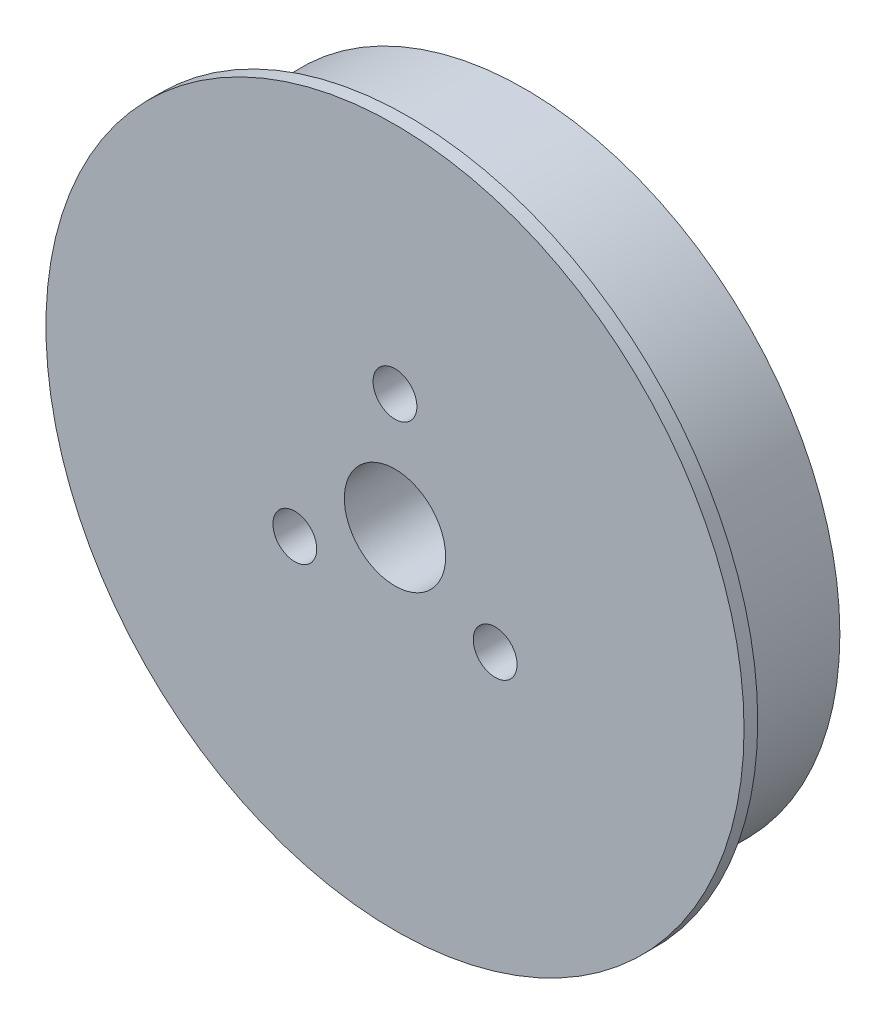
ISO-10303-21;
HEADER;
FILE_DESCRIPTION(('STEP AP214'),'2;1');
FILE_NAME('part.step','',(''),(''),'','','');
FILE_SCHEMA(('AUTOMOTIVE_DESIGN { 1 0 10303 214 1 1 1 1 }'));
ENDSEC;
DATA;
#1=APPLICATION_CONTEXT('core data for automotive mechanical design processes');
#2=APPLICATION_PROTOCOL_DEFINITION('international standard','automotive_design',2000,#1);
#3=PRODUCT_CONTEXT('',#1,'mechanical');
#4=PRODUCT('Part','Part','',(#3));
#5=PRODUCT_RELATED_PRODUCT_CATEGORY('part','',(#4));
#6=PRODUCT_DEFINITION_FORMATION('','',#4);
#7=PRODUCT_DEFINITION_CONTEXT('part definition',#1,'design');
#8=PRODUCT_DEFINITION('design','',#6,#7);
#9=PRODUCT_DEFINITION_SHAPE('','',#8);
#10=(LENGTH_UNIT() NAMED_UNIT(*) SI_UNIT(.MILLI.,.METRE.));
#11=(NAMED_UNIT(*) PLANE_ANGLE_UNIT() SI_UNIT($,.RADIAN.));
#12=(NAMED_UNIT(*) SI_UNIT($,.STERADIAN.) SOLID_ANGLE_UNIT());
#13=UNCERTAINTY_MEASURE_WITH_UNIT(LENGTH_MEASURE(1.E-05),#10,'distance_accuracy_value','');
#14=(GEOMETRIC_REPRESENTATION_CONTEXT(3) GLOBAL_UNCERTAINTY_ASSIGNED_CONTEXT((#13)) GLOBAL_UNIT_ASSIGNED_CONTEXT((#10,
#11,#12)) REPRESENTATION_CONTEXT('',''));
#15=CARTESIAN_POINT('',(0.,0.,0.));
#16=DIRECTION('',(0.,0.,1.));
#17=DIRECTION('',(1.,0.,0.));
#18=AXIS2_PLACEMENT_3D('',#15,#16,#17);
#19=CARTESIAN_POINT('',(0.,0.,0.));
#20=DIRECTION('',(0.,0.,1.));
#21=DIRECTION('',(1.,0.,0.));
#22=AXIS2_PLACEMENT_3D('',#19,#20,#21);
#23=PLANE('',#22);
#24=CARTESIAN_POINT('',(0.,8.45,0.));
#25=DIRECTION('',(0.,0.,-1.));
#26=DIRECTION('',(-1.,0.,0.));
#27=AXIS2_PLACEMENT_3D('',#24,#25,#26);
#28=CIRCLE('',#27,1.60000000000001);
#29=CARTESIAN_POINT('',(-1.60000000000001,8.45,0.));
#30=VERTEX_POINT('',#29);
#31=EDGE_CURVE('E80',#30,#30,#28,.T.);
#32=ORIENTED_EDGE('',*,*,#31,.F.);
#33=EDGE_LOOP('',(#32));
#34=FACE_BOUND('',#33,.T.);
#35=CARTESIAN_POINT('',(7.3179146619785,-4.225,0.));
#36=DIRECTION('',(0.,0.,-1.));
#37=DIRECTION('',(-1.,0.,0.));
#38=AXIS2_PLACEMENT_3D('',#35,#36,#37);
#39=CIRCLE('',#38,1.60000000000002);
#40=CARTESIAN_POINT('',(5.71791466197849,-4.225,0.));
#41=VERTEX_POINT('',#40);
#42=EDGE_CURVE('E74',#41,#41,#39,.T.);
#43=ORIENTED_EDGE('',*,*,#42,.F.);
#44=EDGE_LOOP('',(#43));
#45=FACE_BOUND('',#44,.T.);
#46=CARTESIAN_POINT('',(0.,0.,0.));
#47=DIRECTION('',(0.,0.,1.));
#48=DIRECTION('',(1.,0.,0.));
#49=AXIS2_PLACEMENT_3D('',#46,#47,#48);
#50=CIRCLE('',#49,23.);
#51=CARTESIAN_POINT('',(23.,0.,0.));
#52=VERTEX_POINT('',#51);
#53=EDGE_CURVE('E51',#52,#52,#50,.T.);
#54=ORIENTED_EDGE('',*,*,#53,.F.);
#55=EDGE_LOOP('',(#54));
#56=FACE_BOUND('',#55,.T.);
#57=CARTESIAN_POINT('',(0.,0.,0.));
#58=DIRECTION('',(0.,0.,1.));
#59=DIRECTION('',(1.,0.,0.));
#60=AXIS2_PLACEMENT_3D('',#57,#58,#59);
#61=CIRCLE('',#60,3.7);
#62=CARTESIAN_POINT('',(3.7,0.,0.));
#63=VERTEX_POINT('',#62);
#64=EDGE_CURVE('E46',#63,#63,#61,.T.);
#65=ORIENTED_EDGE('',*,*,#64,.T.);
#66=EDGE_LOOP('',(#65));
#67=FACE_BOUND('',#66,.T.);
#68=CARTESIAN_POINT('',(-7.31791466197851,-4.225,0.));
#69=DIRECTION('',(0.,0.,-1.));
#70=DIRECTION('',(-1.,0.,0.));
#71=AXIS2_PLACEMENT_3D('',#68,#69,#70);
#72=CIRCLE('',#71,1.60000000000001);
#73=CARTESIAN_POINT('',(-8.91791466197852,-4.225,0.));
#74=VERTEX_POINT('',#73);
#75=EDGE_CURVE('E68',#74,#74,#72,.T.);
#76=ORIENTED_EDGE('',*,*,#75,.F.);
#77=EDGE_LOOP('',(#76));
#78=FACE_BOUND('',#77,.T.);
#79=ADVANCED_FACE('F35',(#34,#45,#56,#67,#78),#23,.F.);
#80=CARTESIAN_POINT('',(0.,0.,9.5));
#81=DIRECTION('',(0.,0.,-1.));
#82=DIRECTION('',(-1.,0.,0.));
#83=AXIS2_PLACEMENT_3D('',#80,#81,#82);
#84=CYLINDRICAL_SURFACE('',#83,23.);
#85=ORIENTED_EDGE('',*,*,#53,.T.);
#86=EDGE_LOOP('',(#85));
#87=FACE_BOUND('',#86,.T.);
#88=CARTESIAN_POINT('',(0.,0.,8.5));
#89=DIRECTION('',(0.,0.,1.));
#90=DIRECTION('',(1.,0.,0.));
#91=AXIS2_PLACEMENT_3D('',#88,#89,#90);
#92=CIRCLE('',#91,23.);
#93=CARTESIAN_POINT('',(23.,0.,8.5));
#94=VERTEX_POINT('',#93);
#95=EDGE_CURVE('E10',#94,#94,#92,.T.);
#96=ORIENTED_EDGE('',*,*,#95,.F.);
#97=EDGE_LOOP('',(#96));
#98=FACE_BOUND('',#97,.T.);
#99=ADVANCED_FACE('F37',(#87,#98),#84,.T.);
#100=CARTESIAN_POINT('',(0.,0.,9.5));
#101=DIRECTION('',(0.,0.,-1.));
#102=DIRECTION('',(-1.,0.,0.));
#103=AXIS2_PLACEMENT_3D('',#100,#101,#102);
#104=CYLINDRICAL_SURFACE('',#103,3.7);
#105=CARTESIAN_POINT('',(0.,0.,9.5));
#106=DIRECTION('',(0.,0.,1.));
#107=DIRECTION('',(1.,0.,0.));
#108=AXIS2_PLACEMENT_3D('',#105,#106,#107);
#109=CIRCLE('',#108,3.7);
#110=CARTESIAN_POINT('',(3.7,0.,9.5));
#111=VERTEX_POINT('',#110);
#112=EDGE_CURVE('E42',#111,#111,#109,.T.);
#113=ORIENTED_EDGE('',*,*,#112,.T.);
#114=EDGE_LOOP('',(#113));
#115=FACE_BOUND('',#114,.T.);
#116=ORIENTED_EDGE('',*,*,#64,.F.);
#117=EDGE_LOOP('',(#116));
#118=FACE_BOUND('',#117,.T.);
#119=ADVANCED_FACE('F117',(#115,#118),#104,.F.);
#120=CARTESIAN_POINT('',(0.,0.,9.5));
#121=DIRECTION('',(0.,0.,1.));
#122=DIRECTION('',(1.,0.,0.));
#123=AXIS2_PLACEMENT_3D('',#120,#121,#122);
#124=PLANE('',#123);
#125=CARTESIAN_POINT('',(0.,8.45,9.5));
#126=DIRECTION('',(0.,0.,-1.));
#127=DIRECTION('',(-1.,0.,0.));
#128=AXIS2_PLACEMENT_3D('',#125,#126,#127);
#129=CIRCLE('',#128,1.60000000000001);
#130=CARTESIAN_POINT('',(-1.60000000000001,8.45,9.5));
#131=VERTEX_POINT('',#130);
#132=EDGE_CURVE('E77',#131,#131,#129,.T.);
#133=ORIENTED_EDGE('',*,*,#132,.T.);
#134=EDGE_LOOP('',(#133));
#135=FACE_BOUND('',#134,.T.);
#136=CARTESIAN_POINT('',(7.3179146619785,-4.225,9.5));
#137=DIRECTION('',(0.,0.,-1.));
#138=DIRECTION('',(-1.,0.,0.));
#139=AXIS2_PLACEMENT_3D('',#136,#137,#138);
#140=CIRCLE('',#139,1.60000000000001);
#141=CARTESIAN_POINT('',(5.71791466197849,-4.225,9.5));
#142=VERTEX_POINT('',#141);
#143=EDGE_CURVE('E71',#142,#142,#140,.T.);
#144=ORIENTED_EDGE('',*,*,#143,.T.);
#145=EDGE_LOOP('',(#144));
#146=FACE_BOUND('',#145,.T.);
#147=CARTESIAN_POINT('',(-7.31791466197851,-4.225,9.5));
#148=DIRECTION('',(0.,0.,-1.));
#149=DIRECTION('',(-1.,0.,0.));
#150=AXIS2_PLACEMENT_3D('',#147,#148,#149);
#151=CIRCLE('',#150,1.60000000000001);
#152=CARTESIAN_POINT('',(-8.91791466197852,-4.225,9.5));
#153=VERTEX_POINT('',#152);
#154=EDGE_CURVE('E64',#153,#153,#151,.T.);
#155=ORIENTED_EDGE('',*,*,#154,.T.);
#156=EDGE_LOOP('',(#155));
#157=FACE_BOUND('',#156,.T.);
#158=ORIENTED_EDGE('',*,*,#112,.F.);
#159=EDGE_LOOP('',(#158));
#160=FACE_BOUND('',#159,.T.);
#161=CARTESIAN_POINT('',(0.,0.,9.5));
#162=DIRECTION('',(0.,0.,1.));
#163=DIRECTION('',(1.,0.,0.));
#164=AXIS2_PLACEMENT_3D('',#161,#162,#163);
#165=CIRCLE('',#164,25.5);
#166=CARTESIAN_POINT('',(25.5,0.,9.5));
#167=VERTEX_POINT('',#166);
#168=EDGE_CURVE('E54',#167,#167,#165,.T.);
#169=ORIENTED_EDGE('',*,*,#168,.T.);
#170=EDGE_LOOP('',(#169));
#171=FACE_BOUND('',#170,.T.);
#172=ADVANCED_FACE('F115',(#135,#146,#157,#160,#171),#124,.T.);
#173=CARTESIAN_POINT('',(0.,0.,8.5));
#174=DIRECTION('',(0.,0.,1.));
#175=DIRECTION('',(1.,0.,0.));
#176=AXIS2_PLACEMENT_3D('',#173,#174,#175);
#177=CYLINDRICAL_SURFACE('',#176,25.5);
#178=CARTESIAN_POINT('',(0.,0.,8.5));
#179=DIRECTION('',(0.,0.,1.));
#180=DIRECTION('',(1.,0.,0.));
#181=AXIS2_PLACEMENT_3D('',#178,#179,#180);
#182=CIRCLE('',#181,25.5);
#183=CARTESIAN_POINT('',(25.5,0.,8.5));
#184=VERTEX_POINT('',#183);
#185=EDGE_CURVE('E57',#184,#184,#182,.T.);
#186=ORIENTED_EDGE('',*,*,#185,.T.);
#187=EDGE_LOOP('',(#186));
#188=FACE_BOUND('',#187,.T.);
#189=ORIENTED_EDGE('',*,*,#168,.F.);
#190=EDGE_LOOP('',(#189));
#191=FACE_BOUND('',#190,.T.);
#192=ADVANCED_FACE('F108',(#188,#191),#177,.T.);
#193=CARTESIAN_POINT('',(0.,0.,8.5));
#194=DIRECTION('',(0.,0.,1.));
#195=DIRECTION('',(1.,0.,0.));
#196=AXIS2_PLACEMENT_3D('',#193,#194,#195);
#197=PLANE('',#196);
#198=ORIENTED_EDGE('',*,*,#95,.T.);
#199=EDGE_LOOP('',(#198));
#200=FACE_BOUND('',#199,.T.);
#201=ORIENTED_EDGE('',*,*,#185,.F.);
#202=EDGE_LOOP('',(#201));
#203=FACE_BOUND('',#202,.T.);
#204=ADVANCED_FACE('F99',(#200,#203),#197,.F.);
#205=CARTESIAN_POINT('',(-7.31791466197851,-4.225,0.));
#206=DIRECTION('',(0.,0.,-1.));
#207=DIRECTION('',(-1.,0.,0.));
#208=AXIS2_PLACEMENT_3D('',#205,#206,#207);
#209=CYLINDRICAL_SURFACE('',#208,1.60000000000001);
#210=ORIENTED_EDGE('',*,*,#154,.F.);
#211=EDGE_LOOP('',(#210));
#212=FACE_BOUND('',#211,.T.);
#213=ORIENTED_EDGE('',*,*,#75,.T.);
#214=EDGE_LOOP('',(#213));
#215=FACE_BOUND('',#214,.T.);
#216=ADVANCED_FACE('F96',(#212,#215),#209,.F.);
#217=CARTESIAN_POINT('',(7.3179146619785,-4.225,0.));
#218=DIRECTION('',(0.,0.,-1.));
#219=DIRECTION('',(-1.,0.,0.));
#220=AXIS2_PLACEMENT_3D('',#217,#218,#219);
#221=CYLINDRICAL_SURFACE('',#220,1.60000000000001);
#222=ORIENTED_EDGE('',*,*,#143,.F.);
#223=EDGE_LOOP('',(#222));
#224=FACE_BOUND('',#223,.T.);
#225=ORIENTED_EDGE('',*,*,#42,.T.);
#226=EDGE_LOOP('',(#225));
#227=FACE_BOUND('',#226,.T.);
#228=ADVANCED_FACE('F98',(#224,#227),#221,.F.);
#229=CARTESIAN_POINT('',(0.,8.45,0.));
#230=DIRECTION('',(0.,0.,-1.));
#231=DIRECTION('',(-1.,0.,0.));
#232=AXIS2_PLACEMENT_3D('',#229,#230,#231);
#233=CYLINDRICAL_SURFACE('',#232,1.60000000000001);
#234=ORIENTED_EDGE('',*,*,#132,.F.);
#235=EDGE_LOOP('',(#234));
#236=FACE_BOUND('',#235,.T.);
#237=ORIENTED_EDGE('',*,*,#31,.T.);
#238=EDGE_LOOP('',(#237));
#239=FACE_BOUND('',#238,.T.);
#240=ADVANCED_FACE('F84',(#236,#239),#233,.F.);
#241=CLOSED_SHELL('',(#79,#99,#119,#172,#192,#204,#216,#228,#240));
#242=MANIFOLD_SOLID_BREP('B2',#241);
#243=ADVANCED_BREP_SHAPE_REPRESENTATION('',(#18,#242),#14);
#244=SHAPE_DEFINITION_REPRESENTATION(#9,#243);
ENDSEC;
END-ISO-10303-21;
